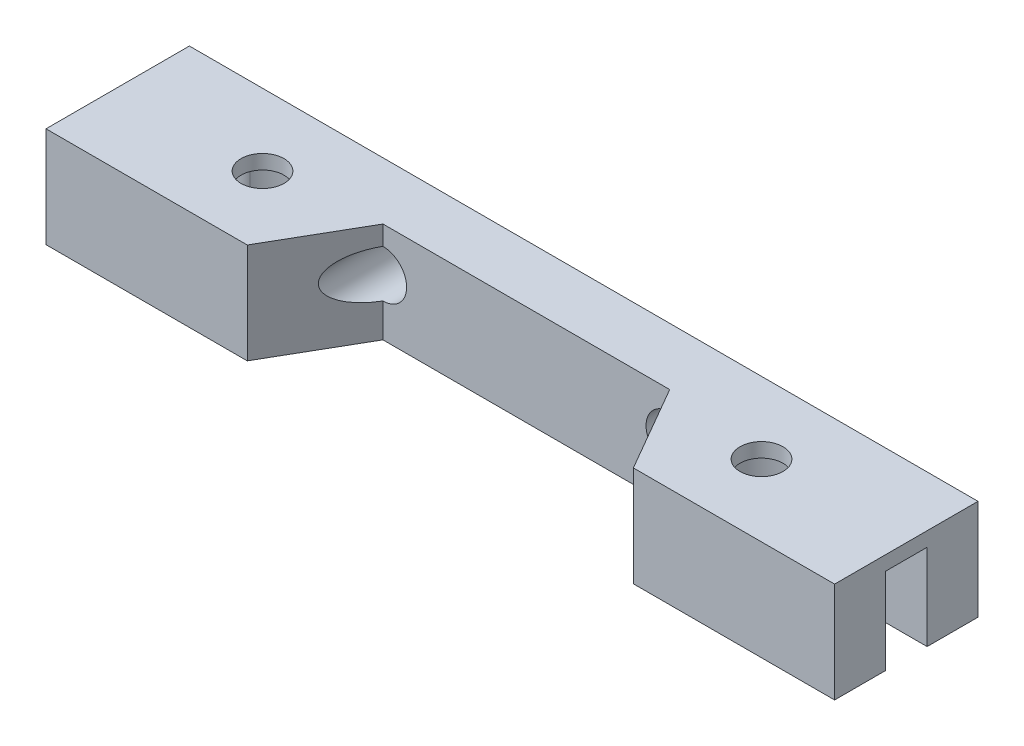
ISO-10303-21;
HEADER;
FILE_DESCRIPTION(('STEP AP214'),'2;1');
FILE_NAME('part.step','',(''),(''),'','','');
FILE_SCHEMA(('AUTOMOTIVE_DESIGN { 1 0 10303 214 1 1 1 1 }'));
ENDSEC;
DATA;
#1=APPLICATION_CONTEXT('core data for automotive mechanical design processes');
#2=APPLICATION_PROTOCOL_DEFINITION('international standard','automotive_design',2000,#1);
#3=PRODUCT_CONTEXT('',#1,'mechanical');
#4=PRODUCT('Part','Part','',(#3));
#5=PRODUCT_RELATED_PRODUCT_CATEGORY('part','',(#4));
#6=PRODUCT_DEFINITION_FORMATION('','',#4);
#7=PRODUCT_DEFINITION_CONTEXT('part definition',#1,'design');
#8=PRODUCT_DEFINITION('design','',#6,#7);
#9=PRODUCT_DEFINITION_SHAPE('','',#8);
#10=(LENGTH_UNIT() NAMED_UNIT(*) SI_UNIT(.MILLI.,.METRE.));
#11=(NAMED_UNIT(*) PLANE_ANGLE_UNIT() SI_UNIT($,.RADIAN.));
#12=(NAMED_UNIT(*) SI_UNIT($,.STERADIAN.) SOLID_ANGLE_UNIT());
#13=UNCERTAINTY_MEASURE_WITH_UNIT(LENGTH_MEASURE(1.E-05),#10,'distance_accuracy_value','');
#14=(GEOMETRIC_REPRESENTATION_CONTEXT(3) GLOBAL_UNCERTAINTY_ASSIGNED_CONTEXT((#13)) GLOBAL_UNIT_ASSIGNED_CONTEXT((#10,
#11,#12)) REPRESENTATION_CONTEXT('',''));
#15=CARTESIAN_POINT('',(0.,0.,0.));
#16=DIRECTION('',(0.,0.,1.));
#17=DIRECTION('',(1.,0.,0.));
#18=AXIS2_PLACEMENT_3D('',#15,#16,#17);
#19=CARTESIAN_POINT('',(-27.5,-3.,0.));
#20=DIRECTION('',(0.,0.,1.));
#21=DIRECTION('',(1.,0.,0.));
#22=AXIS2_PLACEMENT_3D('',#19,#20,#21);
#23=PLANE('',#22);
#24=DIRECTION('',(0.,-1.,0.));
#25=VECTOR('',#24,1.);
#26=CARTESIAN_POINT('',(-13.4641016151377,31.5885506906582,0.));
#27=LINE('',#26,#25);
#28=CARTESIAN_POINT('',(-13.4641016151377,4.,0.));
#29=VERTEX_POINT('',#28);
#30=CARTESIAN_POINT('',(-13.4641016151377,-3.,0.));
#31=VERTEX_POINT('',#30);
#32=EDGE_CURVE('E233',#29,#31,#27,.T.);
#33=ORIENTED_EDGE('',*,*,#32,.F.);
#34=DIRECTION('',(1.,0.,0.));
#35=VECTOR('',#34,1.);
#36=CARTESIAN_POINT('',(-27.5,4.,0.));
#37=LINE('',#36,#35);
#38=CARTESIAN_POINT('',(-27.5,4.,0.));
#39=VERTEX_POINT('',#38);
#40=EDGE_CURVE('E216',#39,#29,#37,.T.);
#41=ORIENTED_EDGE('',*,*,#40,.F.);
#42=DIRECTION('',(0.,1.,0.));
#43=VECTOR('',#42,1.);
#44=CARTESIAN_POINT('',(-27.5,-3.,0.));
#45=LINE('',#44,#43);
#46=CARTESIAN_POINT('',(-27.5,-3.,0.));
#47=VERTEX_POINT('',#46);
#48=EDGE_CURVE('E379',#47,#39,#45,.T.);
#49=ORIENTED_EDGE('',*,*,#48,.F.);
#50=DIRECTION('',(1.,0.,0.));
#51=VECTOR('',#50,1.);
#52=CARTESIAN_POINT('',(-27.5,-3.,0.));
#53=LINE('',#52,#51);
#54=EDGE_CURVE('E323',#47,#31,#53,.T.);
#55=ORIENTED_EDGE('',*,*,#54,.T.);
#56=EDGE_LOOP('',(#33,#41,#49,#55));
#57=FACE_BOUND('',#56,.T.);
#58=ADVANCED_FACE('F44',(#57),#23,.T.);
#59=CARTESIAN_POINT('',(-17.4,-3.,-5.));
#60=DIRECTION('',(0.,1.,0.));
#61=DIRECTION('',(0.,0.,1.));
#62=AXIS2_PLACEMENT_3D('',#59,#60,#61);
#63=CYLINDRICAL_SURFACE('',#62,3.2);
#64=CARTESIAN_POINT('',(-17.4,-3.,-5.));
#65=DIRECTION('',(0.,-1.,0.));
#66=DIRECTION('',(0.,0.,1.));
#67=AXIS2_PLACEMENT_3D('',#64,#65,#66);
#68=CIRCLE('',#67,3.2);
#69=CARTESIAN_POINT('',(-20.0577214707563,-3.,-6.78227848101266));
#70=VERTEX_POINT('',#69);
#71=CARTESIAN_POINT('',(-20.0577214707563,-3.,-3.21772151898734));
#72=VERTEX_POINT('',#71);
#73=EDGE_CURVE('E311',#70,#72,#68,.T.);
#74=ORIENTED_EDGE('',*,*,#73,.T.);
#75=DIRECTION('',(0.,1.,0.));
#76=VECTOR('',#75,1.);
#77=CARTESIAN_POINT('',(-20.0577214707563,-3.,-3.21772151898734));
#78=LINE('',#77,#76);
#79=CARTESIAN_POINT('',(-20.0577214707563,3.,-3.21772151898734));
#80=VERTEX_POINT('',#79);
#81=EDGE_CURVE('E386',#72,#80,#78,.T.);
#82=ORIENTED_EDGE('',*,*,#81,.T.);
#83=CARTESIAN_POINT('',(-17.4,3.,-5.));
#84=DIRECTION('',(0.,-1.,0.));
#85=DIRECTION('',(0.,0.,1.));
#86=AXIS2_PLACEMENT_3D('',#83,#84,#85);
#87=CIRCLE('',#86,3.2);
#88=CARTESIAN_POINT('',(-20.0577214707563,3.,-6.78227848101266));
#89=VERTEX_POINT('',#88);
#90=EDGE_CURVE('E281',#89,#80,#87,.T.);
#91=ORIENTED_EDGE('',*,*,#90,.F.);
#92=DIRECTION('',(0.,1.,0.));
#93=VECTOR('',#92,1.);
#94=CARTESIAN_POINT('',(-20.0577214707563,-3.,-6.78227848101266));
#95=LINE('',#94,#93);
#96=EDGE_CURVE('E362',#89,#70,#95,.F.);
#97=ORIENTED_EDGE('',*,*,#96,.T.);
#98=EDGE_LOOP('',(#74,#82,#91,#97));
#99=FACE_BOUND('',#98,.T.);
#100=ADVANCED_FACE('F498',(#99),#63,.F.);
#101=CARTESIAN_POINT('',(-20.2526303651192,-3.,-6.45));
#102=DIRECTION('',(0.,0.,1.));
#103=DIRECTION('',(1.,0.,0.));
#104=AXIS2_PLACEMENT_3D('',#101,#102,#103);
#105=PLANE('',#104);
#106=DIRECTION('',(1.,0.,0.));
#107=VECTOR('',#106,1.);
#108=CARTESIAN_POINT('',(-20.2526303651192,-3.,-6.45));
#109=LINE('',#108,#107);
#110=CARTESIAN_POINT('',(-27.5,-3.,-6.45));
#111=VERTEX_POINT('',#110);
#112=CARTESIAN_POINT('',(-20.6806249404648,-3.,-6.45));
#113=VERTEX_POINT('',#112);
#114=EDGE_CURVE('E354',#111,#113,#109,.T.);
#115=ORIENTED_EDGE('',*,*,#114,.T.);
#116=DIRECTION('',(0.,1.,0.));
#117=VECTOR('',#116,1.);
#118=CARTESIAN_POINT('',(-20.6806249404648,-3.,-6.45));
#119=LINE('',#118,#117);
#120=CARTESIAN_POINT('',(-20.6806249404648,3.,-6.45));
#121=VERTEX_POINT('',#120);
#122=EDGE_CURVE('E421',#113,#121,#119,.T.);
#123=ORIENTED_EDGE('',*,*,#122,.T.);
#124=DIRECTION('',(1.,0.,0.));
#125=VECTOR('',#124,1.);
#126=CARTESIAN_POINT('',(-20.2526303651192,3.,-6.45));
#127=LINE('',#126,#125);
#128=CARTESIAN_POINT('',(-27.5,3.,-6.45));
#129=VERTEX_POINT('',#128);
#130=EDGE_CURVE('E307',#129,#121,#127,.T.);
#131=ORIENTED_EDGE('',*,*,#130,.F.);
#132=DIRECTION('',(0.,1.,0.));
#133=VECTOR('',#132,1.);
#134=CARTESIAN_POINT('',(-27.5,-3.,-6.45));
#135=LINE('',#134,#133);
#136=EDGE_CURVE('E359',#111,#129,#135,.T.);
#137=ORIENTED_EDGE('',*,*,#136,.F.);
#138=EDGE_LOOP('',(#115,#123,#131,#137));
#139=FACE_BOUND('',#138,.T.);
#140=ADVANCED_FACE('F506',(#139),#105,.T.);
#141=CARTESIAN_POINT('',(-27.5,-3.,-10.));
#142=DIRECTION('',(-1.,0.,0.));
#143=DIRECTION('',(0.,0.,1.));
#144=AXIS2_PLACEMENT_3D('',#141,#142,#143);
#145=PLANE('',#144);
#146=ORIENTED_EDGE('',*,*,#136,.T.);
#147=DIRECTION('',(0.,0.,1.));
#148=VECTOR('',#147,1.);
#149=CARTESIAN_POINT('',(-27.5,3.,-10.));
#150=LINE('',#149,#148);
#151=CARTESIAN_POINT('',(-27.5,3.,-3.55));
#152=VERTEX_POINT('',#151);
#153=EDGE_CURVE('E262',#129,#152,#150,.T.);
#154=ORIENTED_EDGE('',*,*,#153,.T.);
#155=DIRECTION('',(0.,1.,0.));
#156=VECTOR('',#155,1.);
#157=CARTESIAN_POINT('',(-27.5,-3.,-3.55));
#158=LINE('',#157,#156);
#159=CARTESIAN_POINT('',(-27.5,-3.,-3.55));
#160=VERTEX_POINT('',#159);
#161=EDGE_CURVE('E358',#160,#152,#158,.T.);
#162=ORIENTED_EDGE('',*,*,#161,.F.);
#163=DIRECTION('',(0.,0.,1.));
#164=VECTOR('',#163,1.);
#165=CARTESIAN_POINT('',(-27.5,-3.,-3.55));
#166=LINE('',#165,#164);
#167=EDGE_CURVE('E318',#160,#47,#166,.T.);
#168=ORIENTED_EDGE('',*,*,#167,.T.);
#169=ORIENTED_EDGE('',*,*,#48,.T.);
#170=DIRECTION('',(0.,0.,1.));
#171=VECTOR('',#170,1.);
#172=CARTESIAN_POINT('',(-27.5,4.,-10.));
#173=LINE('',#172,#171);
#174=CARTESIAN_POINT('',(-27.5,4.,-10.));
#175=VERTEX_POINT('',#174);
#176=EDGE_CURVE('E266',#175,#39,#173,.T.);
#177=ORIENTED_EDGE('',*,*,#176,.F.);
#178=DIRECTION('',(0.,1.,0.));
#179=VECTOR('',#178,1.);
#180=CARTESIAN_POINT('',(-27.5,-3.,-10.));
#181=LINE('',#180,#179);
#182=CARTESIAN_POINT('',(-27.5,-3.,-10.));
#183=VERTEX_POINT('',#182);
#184=EDGE_CURVE('E363',#183,#175,#181,.T.);
#185=ORIENTED_EDGE('',*,*,#184,.F.);
#186=DIRECTION('',(0.,0.,1.));
#187=VECTOR('',#186,1.);
#188=CARTESIAN_POINT('',(-27.5,-3.,-10.));
#189=LINE('',#188,#187);
#190=EDGE_CURVE('E350',#183,#111,#189,.T.);
#191=ORIENTED_EDGE('',*,*,#190,.T.);
#192=EDGE_LOOP('',(#146,#154,#162,#168,#169,#177,#185,#191));
#193=FACE_BOUND('',#192,.T.);
#194=ADVANCED_FACE('F532',(#193),#145,.T.);
#195=CARTESIAN_POINT('',(27.5,-3.,-10.));
#196=DIRECTION('',(0.,0.,-1.));
#197=DIRECTION('',(-1.,0.,0.));
#198=AXIS2_PLACEMENT_3D('',#195,#196,#197);
#199=PLANE('',#198);
#200=CARTESIAN_POINT('',(10.,1.,-10.));
#201=DIRECTION('',(0.,0.,-1.));
#202=DIRECTION('',(-1.,0.,0.));
#203=AXIS2_PLACEMENT_3D('',#200,#201,#202);
#204=CIRCLE('',#203,1.65);
#205=CARTESIAN_POINT('',(8.35,1.,-10.));
#206=VERTEX_POINT('',#205);
#207=EDGE_CURVE('E258',#206,#206,#204,.T.);
#208=ORIENTED_EDGE('',*,*,#207,.F.);
#209=EDGE_LOOP('',(#208));
#210=FACE_BOUND('',#209,.T.);
#211=CARTESIAN_POINT('',(-10.,1.,-10.));
#212=DIRECTION('',(0.,0.,-1.));
#213=DIRECTION('',(1.,0.,0.));
#214=AXIS2_PLACEMENT_3D('',#211,#212,#213);
#215=CIRCLE('',#214,1.65);
#216=CARTESIAN_POINT('',(-8.35,1.,-10.));
#217=VERTEX_POINT('',#216);
#218=EDGE_CURVE('E251',#217,#217,#215,.T.);
#219=ORIENTED_EDGE('',*,*,#218,.F.);
#220=EDGE_LOOP('',(#219));
#221=FACE_BOUND('',#220,.T.);
#222=ORIENTED_EDGE('',*,*,#184,.T.);
#223=DIRECTION('',(-1.,0.,0.));
#224=VECTOR('',#223,1.);
#225=CARTESIAN_POINT('',(-27.5,4.,-10.));
#226=LINE('',#225,#224);
#227=CARTESIAN_POINT('',(27.5,4.,-10.));
#228=VERTEX_POINT('',#227);
#229=EDGE_CURVE('E277',#228,#175,#226,.T.);
#230=ORIENTED_EDGE('',*,*,#229,.F.);
#231=DIRECTION('',(0.,1.,0.));
#232=VECTOR('',#231,1.);
#233=CARTESIAN_POINT('',(27.5,-3.,-10.));
#234=LINE('',#233,#232);
#235=CARTESIAN_POINT('',(27.5,-3.,-10.));
#236=VERTEX_POINT('',#235);
#237=EDGE_CURVE('E366',#236,#228,#234,.T.);
#238=ORIENTED_EDGE('',*,*,#237,.F.);
#239=DIRECTION('',(-1.,0.,0.));
#240=VECTOR('',#239,1.);
#241=CARTESIAN_POINT('',(27.5,-3.,-10.));
#242=LINE('',#241,#240);
#243=EDGE_CURVE('E346',#236,#183,#242,.T.);
#244=ORIENTED_EDGE('',*,*,#243,.T.);
#245=EDGE_LOOP('',(#222,#230,#238,#244));
#246=FACE_BOUND('',#245,.T.);
#247=ADVANCED_FACE('F487',(#210,#221,#246),#199,.T.);
#248=CARTESIAN_POINT('',(27.5,-3.,-10.));
#249=DIRECTION('',(1.,0.,0.));
#250=DIRECTION('',(0.,0.,-1.));
#251=AXIS2_PLACEMENT_3D('',#248,#249,#250);
#252=PLANE('',#251);
#253=ORIENTED_EDGE('',*,*,#237,.T.);
#254=DIRECTION('',(0.,0.,-1.));
#255=VECTOR('',#254,1.);
#256=CARTESIAN_POINT('',(27.5,4.,-10.));
#257=LINE('',#256,#255);
#258=CARTESIAN_POINT('',(27.5,4.,0.));
#259=VERTEX_POINT('',#258);
#260=EDGE_CURVE('E273',#259,#228,#257,.T.);
#261=ORIENTED_EDGE('',*,*,#260,.F.);
#262=DIRECTION('',(0.,1.,0.));
#263=VECTOR('',#262,1.);
#264=CARTESIAN_POINT('',(27.5,-3.,0.));
#265=LINE('',#264,#263);
#266=CARTESIAN_POINT('',(27.5,-3.,0.));
#267=VERTEX_POINT('',#266);
#268=EDGE_CURVE('E375',#267,#259,#265,.T.);
#269=ORIENTED_EDGE('',*,*,#268,.F.);
#270=DIRECTION('',(0.,0.,-1.));
#271=VECTOR('',#270,1.);
#272=CARTESIAN_POINT('',(27.5,-3.,-3.55000000000001));
#273=LINE('',#272,#271);
#274=CARTESIAN_POINT('',(27.5,-3.,-3.55000000000001));
#275=VERTEX_POINT('',#274);
#276=EDGE_CURVE('E327',#267,#275,#273,.T.);
#277=ORIENTED_EDGE('',*,*,#276,.T.);
#278=DIRECTION('',(0.,1.,0.));
#279=VECTOR('',#278,1.);
#280=CARTESIAN_POINT('',(27.5,-3.,-3.55000000000001));
#281=LINE('',#280,#279);
#282=CARTESIAN_POINT('',(27.5,3.,-3.55000000000001));
#283=VERTEX_POINT('',#282);
#284=EDGE_CURVE('E372',#275,#283,#281,.T.);
#285=ORIENTED_EDGE('',*,*,#284,.T.);
#286=DIRECTION('',(0.,0.,-1.));
#287=VECTOR('',#286,1.);
#288=CARTESIAN_POINT('',(27.5,3.,-10.));
#289=LINE('',#288,#287);
#290=CARTESIAN_POINT('',(27.5,3.,-6.45000000000001));
#291=VERTEX_POINT('',#290);
#292=EDGE_CURVE('E270',#283,#291,#289,.T.);
#293=ORIENTED_EDGE('',*,*,#292,.T.);
#294=DIRECTION('',(0.,1.,0.));
#295=VECTOR('',#294,1.);
#296=CARTESIAN_POINT('',(27.5,-3.,-6.45000000000001));
#297=LINE('',#296,#295);
#298=CARTESIAN_POINT('',(27.5,-3.,-6.45000000000001));
#299=VERTEX_POINT('',#298);
#300=EDGE_CURVE('E369',#299,#291,#297,.T.);
#301=ORIENTED_EDGE('',*,*,#300,.F.);
#302=DIRECTION('',(0.,0.,-1.));
#303=VECTOR('',#302,1.);
#304=CARTESIAN_POINT('',(27.5,-3.,-10.));
#305=LINE('',#304,#303);
#306=EDGE_CURVE('E342',#299,#236,#305,.T.);
#307=ORIENTED_EDGE('',*,*,#306,.T.);
#308=EDGE_LOOP('',(#253,#261,#269,#277,#285,#293,#301,#307));
#309=FACE_BOUND('',#308,.T.);
#310=ADVANCED_FACE('F463',(#309),#252,.T.);
#311=CARTESIAN_POINT('',(20.2526303651192,-3.,-6.45000000000001));
#312=DIRECTION('',(0.,0.,1.));
#313=DIRECTION('',(1.,0.,0.));
#314=AXIS2_PLACEMENT_3D('',#311,#312,#313);
#315=PLANE('',#314);
#316=DIRECTION('',(1.,0.,0.));
#317=VECTOR('',#316,1.);
#318=CARTESIAN_POINT('',(20.2526303651192,3.,-6.45000000000001));
#319=LINE('',#318,#317);
#320=CARTESIAN_POINT('',(20.6806249404649,3.,-6.45000000000001));
#321=VERTEX_POINT('',#320);
#322=EDGE_CURVE('E303',#321,#291,#319,.T.);
#323=ORIENTED_EDGE('',*,*,#322,.F.);
#324=DIRECTION('',(0.,1.,0.));
#325=VECTOR('',#324,1.);
#326=CARTESIAN_POINT('',(20.6806249404649,-3.,-6.45000000000001));
#327=LINE('',#326,#325);
#328=CARTESIAN_POINT('',(20.6806249404649,-3.,-6.45000000000001));
#329=VERTEX_POINT('',#328);
#330=EDGE_CURVE('E436',#321,#329,#327,.F.);
#331=ORIENTED_EDGE('',*,*,#330,.T.);
#332=DIRECTION('',(1.,0.,0.));
#333=VECTOR('',#332,1.);
#334=CARTESIAN_POINT('',(20.2526303651192,-3.,-6.45000000000001));
#335=LINE('',#334,#333);
#336=EDGE_CURVE('E339',#329,#299,#335,.T.);
#337=ORIENTED_EDGE('',*,*,#336,.T.);
#338=ORIENTED_EDGE('',*,*,#300,.T.);
#339=EDGE_LOOP('',(#323,#331,#337,#338));
#340=FACE_BOUND('',#339,.T.);
#341=ADVANCED_FACE('F522',(#340),#315,.T.);
#342=CARTESIAN_POINT('',(17.4,-3.,-5.));
#343=DIRECTION('',(0.,1.,0.));
#344=DIRECTION('',(0.,0.,1.));
#345=AXIS2_PLACEMENT_3D('',#342,#343,#344);
#346=CYLINDRICAL_SURFACE('',#345,3.2);
#347=CARTESIAN_POINT('',(17.4,3.,-5.));
#348=DIRECTION('',(0.,-1.,0.));
#349=DIRECTION('',(0.,0.,-1.));
#350=AXIS2_PLACEMENT_3D('',#347,#348,#349);
#351=CIRCLE('',#350,3.2);
#352=CARTESIAN_POINT('',(20.0577214707563,3.,-3.21772151898735));
#353=VERTEX_POINT('',#352);
#354=CARTESIAN_POINT('',(20.0577214707563,3.,-6.78227848101266));
#355=VERTEX_POINT('',#354);
#356=EDGE_CURVE('E299',#353,#355,#351,.T.);
#357=ORIENTED_EDGE('',*,*,#356,.F.);
#358=DIRECTION('',(0.,1.,0.));
#359=VECTOR('',#358,1.);
#360=CARTESIAN_POINT('',(20.0577214707563,-3.,-3.21772151898735));
#361=LINE('',#360,#359);
#362=CARTESIAN_POINT('',(20.0577214707563,-3.,-3.21772151898735));
#363=VERTEX_POINT('',#362);
#364=EDGE_CURVE('E433',#353,#363,#361,.F.);
#365=ORIENTED_EDGE('',*,*,#364,.T.);
#366=CARTESIAN_POINT('',(17.4,-3.,-5.));
#367=DIRECTION('',(0.,-1.,0.));
#368=DIRECTION('',(0.,0.,-1.));
#369=AXIS2_PLACEMENT_3D('',#366,#367,#368);
#370=CIRCLE('',#369,3.2);
#371=CARTESIAN_POINT('',(20.0577214707563,-3.,-6.78227848101266));
#372=VERTEX_POINT('',#371);
#373=EDGE_CURVE('E335',#363,#372,#370,.T.);
#374=ORIENTED_EDGE('',*,*,#373,.T.);
#375=DIRECTION('',(0.,1.,0.));
#376=VECTOR('',#375,1.);
#377=CARTESIAN_POINT('',(20.0577214707563,-3.,-6.78227848101266));
#378=LINE('',#377,#376);
#379=EDGE_CURVE('E429',#372,#355,#378,.T.);
#380=ORIENTED_EDGE('',*,*,#379,.T.);
#381=EDGE_LOOP('',(#357,#365,#374,#380));
#382=FACE_BOUND('',#381,.T.);
#383=ADVANCED_FACE('F518',(#382),#346,.F.);
#384=CARTESIAN_POINT('',(20.2526303651192,-3.,-3.55000000000001));
#385=DIRECTION('',(0.,0.,-1.));
#386=DIRECTION('',(-1.,0.,0.));
#387=AXIS2_PLACEMENT_3D('',#384,#385,#386);
#388=PLANE('',#387);
#389=DIRECTION('',(-1.,0.,0.));
#390=VECTOR('',#389,1.);
#391=CARTESIAN_POINT('',(20.2526303651192,-3.,-3.55000000000001));
#392=LINE('',#391,#390);
#393=CARTESIAN_POINT('',(20.6806249404649,-3.,-3.55000000000001));
#394=VERTEX_POINT('',#393);
#395=EDGE_CURVE('E331',#275,#394,#392,.T.);
#396=ORIENTED_EDGE('',*,*,#395,.T.);
#397=DIRECTION('',(0.,1.,0.));
#398=VECTOR('',#397,1.);
#399=CARTESIAN_POINT('',(20.6806249404649,-3.,-3.55000000000001));
#400=LINE('',#399,#398);
#401=CARTESIAN_POINT('',(20.6806249404649,3.,-3.55000000000001));
#402=VERTEX_POINT('',#401);
#403=EDGE_CURVE('E425',#394,#402,#400,.T.);
#404=ORIENTED_EDGE('',*,*,#403,.T.);
#405=DIRECTION('',(-1.,0.,0.));
#406=VECTOR('',#405,1.);
#407=CARTESIAN_POINT('',(20.2526303651192,3.,-3.55000000000001));
#408=LINE('',#407,#406);
#409=EDGE_CURVE('E295',#283,#402,#408,.T.);
#410=ORIENTED_EDGE('',*,*,#409,.F.);
#411=ORIENTED_EDGE('',*,*,#284,.F.);
#412=EDGE_LOOP('',(#396,#404,#410,#411));
#413=FACE_BOUND('',#412,.T.);
#414=ADVANCED_FACE('F470',(#413),#388,.T.);
#415=DIRECTION('',(0.,-1.,0.));
#416=VECTOR('',#415,1.);
#417=CARTESIAN_POINT('',(13.4641016151377,31.5885506906582,0.));
#418=LINE('',#417,#416);
#419=CARTESIAN_POINT('',(13.4641016151377,4.,0.));
#420=VERTEX_POINT('',#419);
#421=CARTESIAN_POINT('',(13.4641016151377,-3.,0.));
#422=VERTEX_POINT('',#421);
#423=EDGE_CURVE('E60',#420,#422,#418,.T.);
#424=ORIENTED_EDGE('',*,*,#423,.T.);
#425=EDGE_CURVE('E322',#422,#267,#53,.T.);
#426=ORIENTED_EDGE('',*,*,#425,.T.);
#427=ORIENTED_EDGE('',*,*,#268,.T.);
#428=EDGE_CURVE('E269',#420,#259,#37,.T.);
#429=ORIENTED_EDGE('',*,*,#428,.F.);
#430=EDGE_LOOP('',(#424,#426,#427,#429));
#431=FACE_BOUND('',#430,.T.);
#432=ADVANCED_FACE('F457',(#431),#23,.T.);
#433=CARTESIAN_POINT('',(-20.2526303651192,-3.,-3.55));
#434=DIRECTION('',(0.,0.,-1.));
#435=DIRECTION('',(-1.,0.,0.));
#436=AXIS2_PLACEMENT_3D('',#433,#434,#435);
#437=PLANE('',#436);
#438=DIRECTION('',(-1.,0.,0.));
#439=VECTOR('',#438,1.);
#440=CARTESIAN_POINT('',(-20.2526303651192,3.,-3.55));
#441=LINE('',#440,#439);
#442=CARTESIAN_POINT('',(-20.6806249404648,3.,-3.55));
#443=VERTEX_POINT('',#442);
#444=EDGE_CURVE('E291',#443,#152,#441,.T.);
#445=ORIENTED_EDGE('',*,*,#444,.F.);
#446=DIRECTION('',(0.,1.,0.));
#447=VECTOR('',#446,1.);
#448=CARTESIAN_POINT('',(-20.6806249404648,-3.,-3.55));
#449=LINE('',#448,#447);
#450=CARTESIAN_POINT('',(-20.6806249404648,-3.,-3.55));
#451=VERTEX_POINT('',#450);
#452=EDGE_CURVE('E406',#443,#451,#449,.F.);
#453=ORIENTED_EDGE('',*,*,#452,.T.);
#454=DIRECTION('',(-1.,0.,0.));
#455=VECTOR('',#454,1.);
#456=CARTESIAN_POINT('',(-20.2526303651192,-3.,-3.55));
#457=LINE('',#456,#455);
#458=EDGE_CURVE('E315',#451,#160,#457,.T.);
#459=ORIENTED_EDGE('',*,*,#458,.T.);
#460=ORIENTED_EDGE('',*,*,#161,.T.);
#461=EDGE_LOOP('',(#445,#453,#459,#460));
#462=FACE_BOUND('',#461,.T.);
#463=ADVANCED_FACE('F511',(#462),#437,.T.);
#464=CARTESIAN_POINT('',(-17.4,-3.,-5.));
#465=DIRECTION('',(0.,1.,0.));
#466=DIRECTION('',(0.,0.,1.));
#467=AXIS2_PLACEMENT_3D('',#464,#465,#466);
#468=PLANE('',#467);
#469=DIRECTION('',(1.,0.,0.));
#470=VECTOR('',#469,1.);
#471=CARTESIAN_POINT('',(-10.,-3.,-6.));
#472=LINE('',#471,#470);
#473=CARTESIAN_POINT('',(-10.,-3.,-6.));
#474=VERTEX_POINT('',#473);
#475=CARTESIAN_POINT('',(10.,-3.,-5.99999999999999));
#476=VERTEX_POINT('',#475);
#477=EDGE_CURVE('E222',#474,#476,#472,.T.);
#478=ORIENTED_EDGE('',*,*,#477,.F.);
#479=DIRECTION('',(0.499999999999998,0.,-0.86602540378444));
#480=VECTOR('',#479,1.);
#481=CARTESIAN_POINT('',(-13.4641016151377,-3.,0.));
#482=LINE('',#481,#480);
#483=EDGE_CURVE('E226',#31,#474,#482,.T.);
#484=ORIENTED_EDGE('',*,*,#483,.F.);
#485=ORIENTED_EDGE('',*,*,#54,.F.);
#486=ORIENTED_EDGE('',*,*,#167,.F.);
#487=ORIENTED_EDGE('',*,*,#458,.F.);
#488=CARTESIAN_POINT('',(-20.6806249404648,-3.,-2.8));
#489=DIRECTION('',(0.,1.,0.));
#490=DIRECTION('',(0.,0.,1.));
#491=AXIS2_PLACEMENT_3D('',#488,#489,#490);
#492=CIRCLE('',#491,0.75);
#493=EDGE_CURVE('E418',#451,#72,#492,.F.);
#494=ORIENTED_EDGE('',*,*,#493,.T.);
#495=ORIENTED_EDGE('',*,*,#73,.F.);
#496=CARTESIAN_POINT('',(-20.6806249404648,-3.,-7.2));
#497=DIRECTION('',(0.,1.,0.));
#498=DIRECTION('',(0.,0.,1.));
#499=AXIS2_PLACEMENT_3D('',#496,#497,#498);
#500=CIRCLE('',#499,0.75);
#501=EDGE_CURVE('E415',#70,#113,#500,.F.);
#502=ORIENTED_EDGE('',*,*,#501,.T.);
#503=ORIENTED_EDGE('',*,*,#114,.F.);
#504=ORIENTED_EDGE('',*,*,#190,.F.);
#505=ORIENTED_EDGE('',*,*,#243,.F.);
#506=ORIENTED_EDGE('',*,*,#306,.F.);
#507=ORIENTED_EDGE('',*,*,#336,.F.);
#508=CARTESIAN_POINT('',(20.6806249404649,-3.,-7.2));
#509=DIRECTION('',(0.,1.,0.));
#510=DIRECTION('',(0.,0.,1.));
#511=AXIS2_PLACEMENT_3D('',#508,#509,#510);
#512=CIRCLE('',#511,0.75);
#513=EDGE_CURVE('E409',#329,#372,#512,.F.);
#514=ORIENTED_EDGE('',*,*,#513,.T.);
#515=ORIENTED_EDGE('',*,*,#373,.F.);
#516=CARTESIAN_POINT('',(20.6806249404649,-3.,-2.80000000000001));
#517=DIRECTION('',(0.,1.,0.));
#518=DIRECTION('',(0.,0.,1.));
#519=AXIS2_PLACEMENT_3D('',#516,#517,#518);
#520=CIRCLE('',#519,0.75);
#521=EDGE_CURVE('E412',#363,#394,#520,.F.);
#522=ORIENTED_EDGE('',*,*,#521,.T.);
#523=ORIENTED_EDGE('',*,*,#395,.F.);
#524=ORIENTED_EDGE('',*,*,#276,.F.);
#525=ORIENTED_EDGE('',*,*,#425,.F.);
#526=DIRECTION('',(0.499999999999998,0.,0.86602540378444));
#527=VECTOR('',#526,1.);
#528=CARTESIAN_POINT('',(13.4641016151377,-3.,0.));
#529=LINE('',#528,#527);
#530=EDGE_CURVE('E218',#476,#422,#529,.T.);
#531=ORIENTED_EDGE('',*,*,#530,.F.);
#532=EDGE_LOOP('',(#478,#484,#485,#486,#487,#494,#495,#502,#503,#504,#505,#506,#507,#514,#515,
#522,#523,#524,#525,#531));
#533=FACE_BOUND('',#532,.T.);
#534=ADVANCED_FACE('F465',(#533),#468,.F.);
#535=CARTESIAN_POINT('',(-20.6806249404648,-3.,-2.8));
#536=DIRECTION('',(0.,1.,0.));
#537=DIRECTION('',(0.,0.,1.));
#538=AXIS2_PLACEMENT_3D('',#535,#536,#537);
#539=CYLINDRICAL_SURFACE('',#538,0.75);
#540=ORIENTED_EDGE('',*,*,#493,.F.);
#541=ORIENTED_EDGE('',*,*,#452,.F.);
#542=CARTESIAN_POINT('',(-20.6806249404648,3.,-2.8));
#543=DIRECTION('',(0.,1.,0.));
#544=DIRECTION('',(0.,0.,1.));
#545=AXIS2_PLACEMENT_3D('',#542,#543,#544);
#546=CIRCLE('',#545,0.75);
#547=EDGE_CURVE('E402',#80,#443,#546,.T.);
#548=ORIENTED_EDGE('',*,*,#547,.F.);
#549=ORIENTED_EDGE('',*,*,#81,.F.);
#550=EDGE_LOOP('',(#540,#541,#548,#549));
#551=FACE_BOUND('',#550,.T.);
#552=ADVANCED_FACE('F541',(#551),#539,.T.);
#553=CARTESIAN_POINT('',(-20.6806249404648,-3.,-7.2));
#554=DIRECTION('',(0.,1.,0.));
#555=DIRECTION('',(0.,0.,1.));
#556=AXIS2_PLACEMENT_3D('',#553,#554,#555);
#557=CYLINDRICAL_SURFACE('',#556,0.75);
#558=ORIENTED_EDGE('',*,*,#501,.F.);
#559=ORIENTED_EDGE('',*,*,#96,.F.);
#560=CARTESIAN_POINT('',(-20.6806249404648,3.,-7.2));
#561=DIRECTION('',(0.,1.,0.));
#562=DIRECTION('',(0.,0.,1.));
#563=AXIS2_PLACEMENT_3D('',#560,#561,#562);
#564=CIRCLE('',#563,0.75);
#565=EDGE_CURVE('E398',#121,#89,#564,.T.);
#566=ORIENTED_EDGE('',*,*,#565,.F.);
#567=ORIENTED_EDGE('',*,*,#122,.F.);
#568=EDGE_LOOP('',(#558,#559,#566,#567));
#569=FACE_BOUND('',#568,.T.);
#570=ADVANCED_FACE('F634',(#569),#557,.T.);
#571=CARTESIAN_POINT('',(20.6806249404649,-3.,-2.80000000000001));
#572=DIRECTION('',(0.,1.,0.));
#573=DIRECTION('',(0.,0.,1.));
#574=AXIS2_PLACEMENT_3D('',#571,#572,#573);
#575=CYLINDRICAL_SURFACE('',#574,0.75);
#576=ORIENTED_EDGE('',*,*,#521,.F.);
#577=ORIENTED_EDGE('',*,*,#364,.F.);
#578=CARTESIAN_POINT('',(20.6806249404649,3.,-2.80000000000001));
#579=DIRECTION('',(0.,1.,0.));
#580=DIRECTION('',(0.,0.,1.));
#581=AXIS2_PLACEMENT_3D('',#578,#579,#580);
#582=CIRCLE('',#581,0.75);
#583=EDGE_CURVE('E394',#402,#353,#582,.T.);
#584=ORIENTED_EDGE('',*,*,#583,.F.);
#585=ORIENTED_EDGE('',*,*,#403,.F.);
#586=EDGE_LOOP('',(#576,#577,#584,#585));
#587=FACE_BOUND('',#586,.T.);
#588=ADVANCED_FACE('F473',(#587),#575,.T.);
#589=CARTESIAN_POINT('',(20.6806249404649,-3.,-7.2));
#590=DIRECTION('',(0.,1.,0.));
#591=DIRECTION('',(0.,0.,1.));
#592=AXIS2_PLACEMENT_3D('',#589,#590,#591);
#593=CYLINDRICAL_SURFACE('',#592,0.75);
#594=ORIENTED_EDGE('',*,*,#513,.F.);
#595=ORIENTED_EDGE('',*,*,#330,.F.);
#596=CARTESIAN_POINT('',(20.6806249404649,3.,-7.2));
#597=DIRECTION('',(0.,1.,0.));
#598=DIRECTION('',(0.,0.,1.));
#599=AXIS2_PLACEMENT_3D('',#596,#597,#598);
#600=CIRCLE('',#599,0.75);
#601=EDGE_CURVE('E390',#355,#321,#600,.T.);
#602=ORIENTED_EDGE('',*,*,#601,.F.);
#603=ORIENTED_EDGE('',*,*,#379,.F.);
#604=EDGE_LOOP('',(#594,#595,#602,#603));
#605=FACE_BOUND('',#604,.T.);
#606=ADVANCED_FACE('F46',(#605),#593,.T.);
#607=CARTESIAN_POINT('',(0.,3.,0.));
#608=DIRECTION('',(0.,1.,0.));
#609=DIRECTION('',(0.,0.,1.));
#610=AXIS2_PLACEMENT_3D('',#607,#608,#609);
#611=PLANE('',#610);
#612=CARTESIAN_POINT('',(17.4,3.,-5.));
#613=DIRECTION('',(0.,-1.,0.));
#614=DIRECTION('',(0.,0.,-1.));
#615=AXIS2_PLACEMENT_3D('',#612,#613,#614);
#616=CIRCLE('',#615,1.5);
#617=CARTESIAN_POINT('',(17.4,3.,-6.50000000000001));
#618=VERTEX_POINT('',#617);
#619=EDGE_CURVE('E247',#618,#618,#616,.T.);
#620=ORIENTED_EDGE('',*,*,#619,.F.);
#621=EDGE_LOOP('',(#620));
#622=FACE_BOUND('',#621,.T.);
#623=ORIENTED_EDGE('',*,*,#292,.F.);
#624=ORIENTED_EDGE('',*,*,#409,.T.);
#625=ORIENTED_EDGE('',*,*,#583,.T.);
#626=ORIENTED_EDGE('',*,*,#356,.T.);
#627=ORIENTED_EDGE('',*,*,#601,.T.);
#628=ORIENTED_EDGE('',*,*,#322,.T.);
#629=EDGE_LOOP('',(#623,#624,#625,#626,#627,#628));
#630=FACE_BOUND('',#629,.T.);
#631=ADVANCED_FACE('F477',(#622,#630),#611,.F.);
#632=CARTESIAN_POINT('',(0.,4.,0.));
#633=DIRECTION('',(0.,1.,0.));
#634=DIRECTION('',(0.,0.,1.));
#635=AXIS2_PLACEMENT_3D('',#632,#633,#634);
#636=PLANE('',#635);
#637=DIRECTION('',(0.499999999999998,0.,-0.86602540378444));
#638=VECTOR('',#637,1.);
#639=CARTESIAN_POINT('',(-13.4641016151377,4.,0.));
#640=LINE('',#639,#638);
#641=CARTESIAN_POINT('',(-10.,4.,-6.));
#642=VERTEX_POINT('',#641);
#643=EDGE_CURVE('E204',#29,#642,#640,.T.);
#644=ORIENTED_EDGE('',*,*,#643,.T.);
#645=DIRECTION('',(1.,0.,0.));
#646=VECTOR('',#645,1.);
#647=CARTESIAN_POINT('',(-10.,4.,-6.));
#648=LINE('',#647,#646);
#649=CARTESIAN_POINT('',(10.,4.,-5.99999999999999));
#650=VERTEX_POINT('',#649);
#651=EDGE_CURVE('E193',#642,#650,#648,.T.);
#652=ORIENTED_EDGE('',*,*,#651,.T.);
#653=DIRECTION('',(0.499999999999998,0.,0.86602540378444));
#654=VECTOR('',#653,1.);
#655=CARTESIAN_POINT('',(13.4641016151377,4.,0.));
#656=LINE('',#655,#654);
#657=EDGE_CURVE('E228',#650,#420,#656,.T.);
#658=ORIENTED_EDGE('',*,*,#657,.T.);
#659=ORIENTED_EDGE('',*,*,#428,.T.);
#660=ORIENTED_EDGE('',*,*,#260,.T.);
#661=ORIENTED_EDGE('',*,*,#229,.T.);
#662=ORIENTED_EDGE('',*,*,#176,.T.);
#663=ORIENTED_EDGE('',*,*,#40,.T.);
#664=EDGE_LOOP('',(#644,#652,#658,#659,#660,#661,#662,#663));
#665=FACE_BOUND('',#664,.T.);
#666=CARTESIAN_POINT('',(-17.4,4.,-5.));
#667=DIRECTION('',(0.,1.,0.));
#668=DIRECTION('',(0.,0.,1.));
#669=AXIS2_PLACEMENT_3D('',#666,#667,#668);
#670=CIRCLE('',#669,1.5);
#671=CARTESIAN_POINT('',(-17.4,4.,-3.5));
#672=VERTEX_POINT('',#671);
#673=EDGE_CURVE('E246',#672,#672,#670,.F.);
#674=ORIENTED_EDGE('',*,*,#673,.T.);
#675=EDGE_LOOP('',(#674));
#676=FACE_BOUND('',#675,.T.);
#677=CARTESIAN_POINT('',(17.4,4.,-5.));
#678=DIRECTION('',(0.,1.,0.));
#679=DIRECTION('',(0.,0.,1.));
#680=AXIS2_PLACEMENT_3D('',#677,#678,#679);
#681=CIRCLE('',#680,1.5);
#682=CARTESIAN_POINT('',(17.4,4.,-3.5));
#683=VERTEX_POINT('',#682);
#684=EDGE_CURVE('E241',#683,#683,#681,.F.);
#685=ORIENTED_EDGE('',*,*,#684,.T.);
#686=EDGE_LOOP('',(#685));
#687=FACE_BOUND('',#686,.T.);
#688=ADVANCED_FACE('F212',(#665,#676,#687),#636,.T.);
#689=CARTESIAN_POINT('',(-17.4,3.,-5.));
#690=DIRECTION('',(0.,-1.,0.));
#691=DIRECTION('',(0.,0.,-1.));
#692=AXIS2_PLACEMENT_3D('',#689,#690,#691);
#693=CIRCLE('',#692,1.5);
#694=CARTESIAN_POINT('',(-17.4,3.,-6.5));
#695=VERTEX_POINT('',#694);
#696=EDGE_CURVE('E242',#695,#695,#693,.T.);
#697=ORIENTED_EDGE('',*,*,#696,.F.);
#698=EDGE_LOOP('',(#697));
#699=FACE_BOUND('',#698,.T.);
#700=ORIENTED_EDGE('',*,*,#547,.T.);
#701=ORIENTED_EDGE('',*,*,#444,.T.);
#702=ORIENTED_EDGE('',*,*,#153,.F.);
#703=ORIENTED_EDGE('',*,*,#130,.T.);
#704=ORIENTED_EDGE('',*,*,#565,.T.);
#705=ORIENTED_EDGE('',*,*,#90,.T.);
#706=EDGE_LOOP('',(#700,#701,#702,#703,#704,#705));
#707=FACE_BOUND('',#706,.T.);
#708=ADVANCED_FACE('F542',(#699,#707),#611,.F.);
#709=CARTESIAN_POINT('',(-10.,1.,4.66690475583122));
#710=DIRECTION('',(0.,0.,-1.));
#711=DIRECTION('',(-1.,0.,0.));
#712=AXIS2_PLACEMENT_3D('',#709,#710,#711);
#713=CYLINDRICAL_SURFACE('',#712,1.65);
#714=CARTESIAN_POINT('',(-10.,1.,-6.));
#715=DIRECTION('',(0.,0.,-1.));
#716=DIRECTION('',(-1.,0.,0.));
#717=AXIS2_PLACEMENT_3D('',#714,#715,#716);
#718=CIRCLE('',#717,1.65);
#719=CARTESIAN_POINT('',(-10.,-0.649999999999998,-6.));
#720=VERTEX_POINT('',#719);
#721=CARTESIAN_POINT('',(-10.,2.65,-6.));
#722=VERTEX_POINT('',#721);
#723=EDGE_CURVE('E238',#720,#722,#718,.F.);
#724=ORIENTED_EDGE('',*,*,#723,.T.);
#725=CARTESIAN_POINT('',(-10.,1.,-5.99999999999999));
#726=DIRECTION('',(-0.86602540378444,0.,-0.499999999999998));
#727=DIRECTION('',(0.499999999999998,0.,-0.86602540378444));
#728=AXIS2_PLACEMENT_3D('',#725,#726,#727);
#729=ELLIPSE('',#728,3.30000000000001,1.65);
#730=EDGE_CURVE('E11',#722,#720,#729,.F.);
#731=ORIENTED_EDGE('',*,*,#730,.T.);
#732=EDGE_LOOP('',(#724,#731));
#733=FACE_BOUND('',#732,.T.);
#734=ORIENTED_EDGE('',*,*,#218,.T.);
#735=EDGE_LOOP('',(#734));
#736=FACE_BOUND('',#735,.T.);
#737=ADVANCED_FACE('F545',(#733,#736),#713,.F.);
#738=CARTESIAN_POINT('',(10.,1.,4.66690475583122));
#739=DIRECTION('',(0.,0.,-1.));
#740=DIRECTION('',(-1.,0.,0.));
#741=AXIS2_PLACEMENT_3D('',#738,#739,#740);
#742=CYLINDRICAL_SURFACE('',#741,1.65);
#743=CARTESIAN_POINT('',(10.,1.,-6.));
#744=DIRECTION('',(0.86602540378444,0.,-0.499999999999998));
#745=DIRECTION('',(-0.499999999999998,0.,-0.86602540378444));
#746=AXIS2_PLACEMENT_3D('',#743,#744,#745);
#747=ELLIPSE('',#746,3.30000000000002,1.65);
#748=CARTESIAN_POINT('',(10.,-0.649999999999998,-5.99999999999999));
#749=VERTEX_POINT('',#748);
#750=CARTESIAN_POINT('',(10.,2.65,-5.99999999999999));
#751=VERTEX_POINT('',#750);
#752=EDGE_CURVE('E439',#749,#751,#747,.F.);
#753=ORIENTED_EDGE('',*,*,#752,.T.);
#754=CARTESIAN_POINT('',(10.,1.,-5.99999999999999));
#755=DIRECTION('',(0.,0.,-1.));
#756=DIRECTION('',(-1.,0.,0.));
#757=AXIS2_PLACEMENT_3D('',#754,#755,#756);
#758=CIRCLE('',#757,1.65);
#759=EDGE_CURVE('E53',#751,#749,#758,.F.);
#760=ORIENTED_EDGE('',*,*,#759,.T.);
#761=EDGE_LOOP('',(#753,#760));
#762=FACE_BOUND('',#761,.T.);
#763=ORIENTED_EDGE('',*,*,#207,.T.);
#764=EDGE_LOOP('',(#763));
#765=FACE_BOUND('',#764,.T.);
#766=ADVANCED_FACE('F445',(#762,#765),#742,.F.);
#767=CARTESIAN_POINT('',(-17.4,8.24264068711929,-5.));
#768=DIRECTION('',(0.,-1.,0.));
#769=DIRECTION('',(0.,0.,-1.));
#770=AXIS2_PLACEMENT_3D('',#767,#768,#769);
#771=CYLINDRICAL_SURFACE('',#770,1.5);
#772=ORIENTED_EDGE('',*,*,#696,.T.);
#773=EDGE_LOOP('',(#772));
#774=FACE_BOUND('',#773,.T.);
#775=ORIENTED_EDGE('',*,*,#673,.F.);
#776=EDGE_LOOP('',(#775));
#777=FACE_BOUND('',#776,.T.);
#778=ADVANCED_FACE('F554',(#774,#777),#771,.F.);
#779=CARTESIAN_POINT('',(17.4,8.24264068711929,-5.));
#780=DIRECTION('',(0.,-1.,0.));
#781=DIRECTION('',(0.,0.,-1.));
#782=AXIS2_PLACEMENT_3D('',#779,#780,#781);
#783=CYLINDRICAL_SURFACE('',#782,1.5);
#784=ORIENTED_EDGE('',*,*,#619,.T.);
#785=EDGE_LOOP('',(#784));
#786=FACE_BOUND('',#785,.T.);
#787=ORIENTED_EDGE('',*,*,#684,.F.);
#788=EDGE_LOOP('',(#787));
#789=FACE_BOUND('',#788,.T.);
#790=ADVANCED_FACE('F555',(#786,#789),#783,.F.);
#791=CARTESIAN_POINT('',(-13.4641016151377,31.5885506906582,0.));
#792=DIRECTION('',(-0.86602540378444,0.,-0.499999999999998));
#793=DIRECTION('',(-0.499999999999998,0.,0.86602540378444));
#794=AXIS2_PLACEMENT_3D('',#791,#792,#793);
#795=PLANE('',#794);
#796=DIRECTION('',(0.,-1.,0.));
#797=VECTOR('',#796,1.);
#798=CARTESIAN_POINT('',(-10.,31.5885506906582,-6.));
#799=LINE('',#798,#797);
#800=EDGE_CURVE('E68',#642,#722,#799,.T.);
#801=ORIENTED_EDGE('',*,*,#800,.F.);
#802=ORIENTED_EDGE('',*,*,#643,.F.);
#803=ORIENTED_EDGE('',*,*,#32,.T.);
#804=ORIENTED_EDGE('',*,*,#483,.T.);
#805=EDGE_CURVE('E209',#720,#474,#799,.T.);
#806=ORIENTED_EDGE('',*,*,#805,.F.);
#807=ORIENTED_EDGE('',*,*,#730,.F.);
#808=EDGE_LOOP('',(#801,#802,#803,#804,#806,#807));
#809=FACE_BOUND('',#808,.T.);
#810=ADVANCED_FACE('F203',(#809),#795,.F.);
#811=CARTESIAN_POINT('',(-10.,31.5885506906582,-6.));
#812=DIRECTION('',(0.,0.,-1.));
#813=DIRECTION('',(-1.,0.,0.));
#814=AXIS2_PLACEMENT_3D('',#811,#812,#813);
#815=PLANE('',#814);
#816=ORIENTED_EDGE('',*,*,#805,.T.);
#817=ORIENTED_EDGE('',*,*,#477,.T.);
#818=DIRECTION('',(0.,-1.,0.));
#819=VECTOR('',#818,1.);
#820=CARTESIAN_POINT('',(10.,31.5885506906582,-5.99999999999999));
#821=LINE('',#820,#819);
#822=EDGE_CURVE('E200',#749,#476,#821,.T.);
#823=ORIENTED_EDGE('',*,*,#822,.F.);
#824=ORIENTED_EDGE('',*,*,#759,.F.);
#825=EDGE_CURVE('E196',#650,#751,#821,.T.);
#826=ORIENTED_EDGE('',*,*,#825,.F.);
#827=ORIENTED_EDGE('',*,*,#651,.F.);
#828=ORIENTED_EDGE('',*,*,#800,.T.);
#829=ORIENTED_EDGE('',*,*,#723,.F.);
#830=EDGE_LOOP('',(#816,#817,#823,#824,#826,#827,#828,#829));
#831=FACE_BOUND('',#830,.T.);
#832=ADVANCED_FACE('F194',(#831),#815,.F.);
#833=CARTESIAN_POINT('',(13.4641016151377,31.5885506906582,0.));
#834=DIRECTION('',(0.86602540378444,0.,-0.499999999999998));
#835=DIRECTION('',(-0.499999999999998,0.,-0.86602540378444));
#836=AXIS2_PLACEMENT_3D('',#833,#834,#835);
#837=PLANE('',#836);
#838=ORIENTED_EDGE('',*,*,#822,.T.);
#839=ORIENTED_EDGE('',*,*,#530,.T.);
#840=ORIENTED_EDGE('',*,*,#423,.F.);
#841=ORIENTED_EDGE('',*,*,#657,.F.);
#842=ORIENTED_EDGE('',*,*,#825,.T.);
#843=ORIENTED_EDGE('',*,*,#752,.F.);
#844=EDGE_LOOP('',(#838,#839,#840,#841,#842,#843));
#845=FACE_BOUND('',#844,.T.);
#846=ADVANCED_FACE('F490',(#845),#837,.F.);
#847=CLOSED_SHELL('',(#58,#100,#140,#194,#247,#310,#341,#383,#414,#432,#463,#534,#552,#570,#588,
#606,#631,#688,#708,#737,#766,#778,#790,#810,#832,#846));
#848=MANIFOLD_SOLID_BREP('B2',#847);
#849=ADVANCED_BREP_SHAPE_REPRESENTATION('',(#18,#848),#14);
#850=SHAPE_DEFINITION_REPRESENTATION(#9,#849);
ENDSEC;
END-ISO-10303-21;
